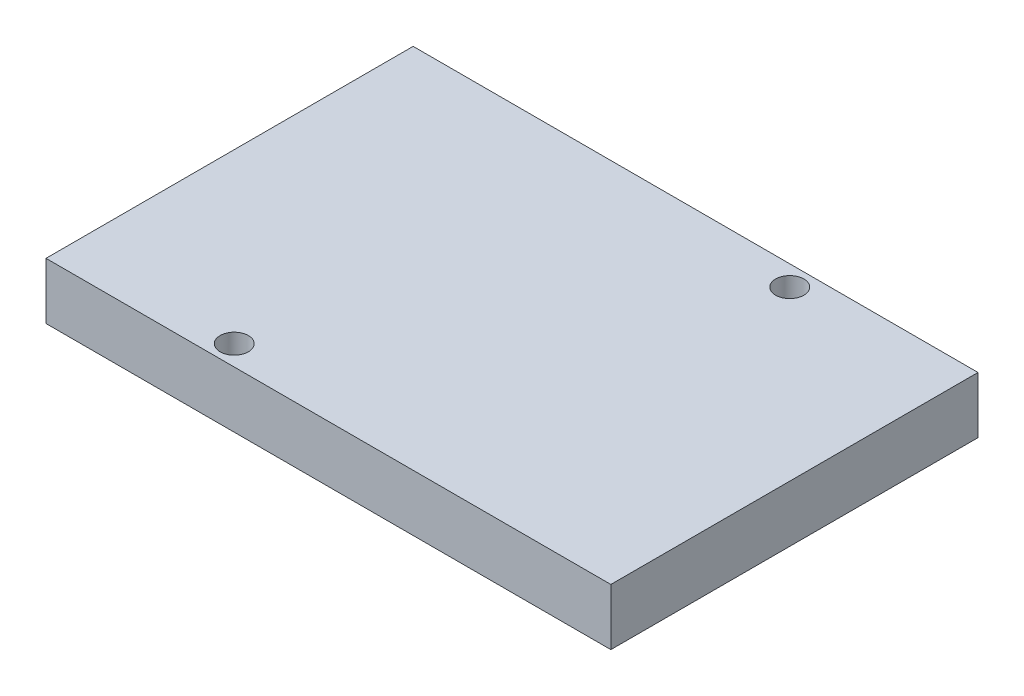
ISO-10303-21;
HEADER;
FILE_DESCRIPTION(('STEP AP214'),'2;1');
FILE_NAME('part.step','',(''),(''),'','','');
FILE_SCHEMA(('AUTOMOTIVE_DESIGN { 1 0 10303 214 1 1 1 1 }'));
ENDSEC;
DATA;
#1=APPLICATION_CONTEXT('core data for automotive mechanical design processes');
#2=APPLICATION_PROTOCOL_DEFINITION('international standard','automotive_design',2000,#1);
#3=PRODUCT_CONTEXT('',#1,'mechanical');
#4=PRODUCT('Part','Part','',(#3));
#5=PRODUCT_RELATED_PRODUCT_CATEGORY('part','',(#4));
#6=PRODUCT_DEFINITION_FORMATION('','',#4);
#7=PRODUCT_DEFINITION_CONTEXT('part definition',#1,'design');
#8=PRODUCT_DEFINITION('design','',#6,#7);
#9=PRODUCT_DEFINITION_SHAPE('','',#8);
#10=(LENGTH_UNIT() NAMED_UNIT(*) SI_UNIT(.MILLI.,.METRE.));
#11=(NAMED_UNIT(*) PLANE_ANGLE_UNIT() SI_UNIT($,.RADIAN.));
#12=(NAMED_UNIT(*) SI_UNIT($,.STERADIAN.) SOLID_ANGLE_UNIT());
#13=UNCERTAINTY_MEASURE_WITH_UNIT(LENGTH_MEASURE(1.E-05),#10,'distance_accuracy_value','');
#14=(GEOMETRIC_REPRESENTATION_CONTEXT(3) GLOBAL_UNCERTAINTY_ASSIGNED_CONTEXT((#13)) GLOBAL_UNIT_ASSIGNED_CONTEXT((#10,
#11,#12)) REPRESENTATION_CONTEXT('',''));
#15=CARTESIAN_POINT('',(0.,0.,0.));
#16=DIRECTION('',(0.,0.,1.));
#17=DIRECTION('',(1.,0.,0.));
#18=AXIS2_PLACEMENT_3D('',#15,#16,#17);
#19=CARTESIAN_POINT('',(0.,10.,0.));
#20=DIRECTION('',(1.,0.,0.));
#21=DIRECTION('',(0.,0.,-1.));
#22=AXIS2_PLACEMENT_3D('',#19,#20,#21);
#23=PLANE('',#22);
#24=DIRECTION('',(0.,0.,1.));
#25=VECTOR('',#24,1.);
#26=CARTESIAN_POINT('',(0.,0.,0.));
#27=LINE('',#26,#25);
#28=CARTESIAN_POINT('',(0.,0.,-65.));
#29=VERTEX_POINT('',#28);
#30=CARTESIAN_POINT('',(0.,0.,0.));
#31=VERTEX_POINT('',#30);
#32=EDGE_CURVE('E102',#29,#31,#27,.T.);
#33=ORIENTED_EDGE('',*,*,#32,.T.);
#34=DIRECTION('',(0.,-1.,0.));
#35=VECTOR('',#34,1.);
#36=CARTESIAN_POINT('',(0.,10.,0.));
#37=LINE('',#36,#35);
#38=CARTESIAN_POINT('',(0.,10.,0.));
#39=VERTEX_POINT('',#38);
#40=EDGE_CURVE('E12',#39,#31,#37,.T.);
#41=ORIENTED_EDGE('',*,*,#40,.F.);
#42=DIRECTION('',(0.,0.,1.));
#43=VECTOR('',#42,1.);
#44=CARTESIAN_POINT('',(0.,10.,0.));
#45=LINE('',#44,#43);
#46=CARTESIAN_POINT('',(0.,10.,-65.));
#47=VERTEX_POINT('',#46);
#48=EDGE_CURVE('E90',#47,#39,#45,.T.);
#49=ORIENTED_EDGE('',*,*,#48,.F.);
#50=DIRECTION('',(0.,-1.,0.));
#51=VECTOR('',#50,1.);
#52=CARTESIAN_POINT('',(0.,10.,-65.));
#53=LINE('',#52,#51);
#54=EDGE_CURVE('E98',#47,#29,#53,.T.);
#55=ORIENTED_EDGE('',*,*,#54,.T.);
#56=EDGE_LOOP('',(#33,#41,#49,#55));
#57=FACE_BOUND('',#56,.T.);
#58=ADVANCED_FACE('F39',(#57),#23,.F.);
#59=CARTESIAN_POINT('',(0.,10.,0.));
#60=DIRECTION('',(0.,0.,-1.));
#61=DIRECTION('',(-1.,0.,0.));
#62=AXIS2_PLACEMENT_3D('',#59,#60,#61);
#63=PLANE('',#62);
#64=DIRECTION('',(1.,0.,0.));
#65=VECTOR('',#64,1.);
#66=CARTESIAN_POINT('',(0.,0.,0.));
#67=LINE('',#66,#65);
#68=CARTESIAN_POINT('',(100.,0.,0.));
#69=VERTEX_POINT('',#68);
#70=EDGE_CURVE('E94',#31,#69,#67,.T.);
#71=ORIENTED_EDGE('',*,*,#70,.T.);
#72=DIRECTION('',(0.,-1.,0.));
#73=VECTOR('',#72,1.);
#74=CARTESIAN_POINT('',(100.,10.,0.));
#75=LINE('',#74,#73);
#76=CARTESIAN_POINT('',(100.,10.,0.));
#77=VERTEX_POINT('',#76);
#78=EDGE_CURVE('E47',#77,#69,#75,.T.);
#79=ORIENTED_EDGE('',*,*,#78,.F.);
#80=DIRECTION('',(1.,0.,0.));
#81=VECTOR('',#80,1.);
#82=CARTESIAN_POINT('',(0.,10.,0.));
#83=LINE('',#82,#81);
#84=EDGE_CURVE('E85',#39,#77,#83,.T.);
#85=ORIENTED_EDGE('',*,*,#84,.F.);
#86=ORIENTED_EDGE('',*,*,#40,.T.);
#87=EDGE_LOOP('',(#71,#79,#85,#86));
#88=FACE_BOUND('',#87,.T.);
#89=ADVANCED_FACE('F93',(#88),#63,.F.);
#90=CARTESIAN_POINT('',(100.,10.,0.));
#91=DIRECTION('',(-1.,0.,0.));
#92=DIRECTION('',(0.,0.,1.));
#93=AXIS2_PLACEMENT_3D('',#90,#91,#92);
#94=PLANE('',#93);
#95=DIRECTION('',(0.,0.,-1.));
#96=VECTOR('',#95,1.);
#97=CARTESIAN_POINT('',(100.,0.,0.));
#98=LINE('',#97,#96);
#99=CARTESIAN_POINT('',(100.,0.,-65.));
#100=VERTEX_POINT('',#99);
#101=EDGE_CURVE('E72',#69,#100,#98,.T.);
#102=ORIENTED_EDGE('',*,*,#101,.T.);
#103=DIRECTION('',(0.,-1.,0.));
#104=VECTOR('',#103,1.);
#105=CARTESIAN_POINT('',(100.,10.,-65.));
#106=LINE('',#105,#104);
#107=CARTESIAN_POINT('',(100.,10.,-65.));
#108=VERTEX_POINT('',#107);
#109=EDGE_CURVE('E95',#108,#100,#106,.T.);
#110=ORIENTED_EDGE('',*,*,#109,.F.);
#111=DIRECTION('',(0.,0.,-1.));
#112=VECTOR('',#111,1.);
#113=CARTESIAN_POINT('',(100.,10.,0.));
#114=LINE('',#113,#112);
#115=EDGE_CURVE('E88',#77,#108,#114,.T.);
#116=ORIENTED_EDGE('',*,*,#115,.F.);
#117=ORIENTED_EDGE('',*,*,#78,.T.);
#118=EDGE_LOOP('',(#102,#110,#116,#117));
#119=FACE_BOUND('',#118,.T.);
#120=ADVANCED_FACE('F96',(#119),#94,.F.);
#121=CARTESIAN_POINT('',(0.,10.,-65.));
#122=DIRECTION('',(0.,0.,1.));
#123=DIRECTION('',(1.,0.,0.));
#124=AXIS2_PLACEMENT_3D('',#121,#122,#123);
#125=PLANE('',#124);
#126=CARTESIAN_POINT('',(59.,5.,-65.));
#127=DIRECTION('',(0.,0.,-1.));
#128=DIRECTION('',(-1.,0.,0.));
#129=AXIS2_PLACEMENT_3D('',#126,#127,#128);
#130=CIRCLE('',#129,2.49999999999999);
#131=CARTESIAN_POINT('',(56.5,5.,-65.));
#132=VERTEX_POINT('',#131);
#133=EDGE_CURVE('E123',#132,#132,#130,.T.);
#134=ORIENTED_EDGE('',*,*,#133,.F.);
#135=EDGE_LOOP('',(#134));
#136=FACE_BOUND('',#135,.T.);
#137=CARTESIAN_POINT('',(41.,5.,-65.));
#138=DIRECTION('',(0.,0.,-1.));
#139=DIRECTION('',(-1.,0.,0.));
#140=AXIS2_PLACEMENT_3D('',#137,#138,#139);
#141=CIRCLE('',#140,2.49999999999999);
#142=CARTESIAN_POINT('',(38.5,5.,-65.));
#143=VERTEX_POINT('',#142);
#144=EDGE_CURVE('E119',#143,#143,#141,.T.);
#145=ORIENTED_EDGE('',*,*,#144,.F.);
#146=EDGE_LOOP('',(#145));
#147=FACE_BOUND('',#146,.T.);
#148=DIRECTION('',(-1.,0.,0.));
#149=VECTOR('',#148,1.);
#150=CARTESIAN_POINT('',(0.,0.,-65.));
#151=LINE('',#150,#149);
#152=EDGE_CURVE('E78',#100,#29,#151,.T.);
#153=ORIENTED_EDGE('',*,*,#152,.T.);
#154=ORIENTED_EDGE('',*,*,#54,.F.);
#155=DIRECTION('',(-1.,0.,0.));
#156=VECTOR('',#155,1.);
#157=CARTESIAN_POINT('',(0.,10.,-65.));
#158=LINE('',#157,#156);
#159=EDGE_CURVE('E55',#108,#47,#158,.T.);
#160=ORIENTED_EDGE('',*,*,#159,.F.);
#161=ORIENTED_EDGE('',*,*,#109,.T.);
#162=EDGE_LOOP('',(#153,#154,#160,#161));
#163=FACE_BOUND('',#162,.T.);
#164=ADVANCED_FACE('F110',(#136,#147,#163),#125,.F.);
#165=CARTESIAN_POINT('',(0.,10.,0.));
#166=DIRECTION('',(0.,-1.,0.));
#167=DIRECTION('',(0.,0.,-1.));
#168=AXIS2_PLACEMENT_3D('',#165,#166,#167);
#169=PLANE('',#168);
#170=CARTESIAN_POINT('',(70.25,10.,-61.425));
#171=DIRECTION('',(0.,1.,0.));
#172=DIRECTION('',(0.,0.,1.));
#173=AXIS2_PLACEMENT_3D('',#170,#171,#172);
#174=CIRCLE('',#173,2.50000000000001);
#175=CARTESIAN_POINT('',(70.25,10.,-58.925));
#176=VERTEX_POINT('',#175);
#177=EDGE_CURVE('E131',#176,#176,#174,.T.);
#178=ORIENTED_EDGE('',*,*,#177,.F.);
#179=EDGE_LOOP('',(#178));
#180=FACE_BOUND('',#179,.T.);
#181=CARTESIAN_POINT('',(29.75,10.,-3.575));
#182=DIRECTION('',(0.,1.,0.));
#183=DIRECTION('',(0.,0.,1.));
#184=AXIS2_PLACEMENT_3D('',#181,#182,#183);
#185=CIRCLE('',#184,2.49999999999999);
#186=CARTESIAN_POINT('',(29.75,10.,-1.07500000000001));
#187=VERTEX_POINT('',#186);
#188=EDGE_CURVE('E128',#187,#187,#185,.T.);
#189=ORIENTED_EDGE('',*,*,#188,.F.);
#190=EDGE_LOOP('',(#189));
#191=FACE_BOUND('',#190,.T.);
#192=ORIENTED_EDGE('',*,*,#48,.T.);
#193=ORIENTED_EDGE('',*,*,#84,.T.);
#194=ORIENTED_EDGE('',*,*,#115,.T.);
#195=ORIENTED_EDGE('',*,*,#159,.T.);
#196=EDGE_LOOP('',(#192,#193,#194,#195));
#197=FACE_BOUND('',#196,.T.);
#198=ADVANCED_FACE('F86',(#180,#191,#197),#169,.F.);
#199=CARTESIAN_POINT('',(0.,0.,0.));
#200=DIRECTION('',(0.,-1.,0.));
#201=DIRECTION('',(0.,0.,-1.));
#202=AXIS2_PLACEMENT_3D('',#199,#200,#201);
#203=PLANE('',#202);
#204=ORIENTED_EDGE('',*,*,#32,.F.);
#205=ORIENTED_EDGE('',*,*,#152,.F.);
#206=ORIENTED_EDGE('',*,*,#101,.F.);
#207=ORIENTED_EDGE('',*,*,#70,.F.);
#208=EDGE_LOOP('',(#204,#205,#206,#207));
#209=FACE_BOUND('',#208,.T.);
#210=ADVANCED_FACE('F113',(#209),#203,.T.);
#211=CARTESIAN_POINT('',(41.,5.,-55.));
#212=DIRECTION('',(0.,0.,-1.));
#213=DIRECTION('',(-1.,0.,0.));
#214=AXIS2_PLACEMENT_3D('',#211,#212,#213);
#215=CYLINDRICAL_SURFACE('',#214,2.49999999999999);
#216=CARTESIAN_POINT('',(41.,5.,-55.));
#217=DIRECTION('',(0.,0.,-1.));
#218=DIRECTION('',(-1.,0.,0.));
#219=AXIS2_PLACEMENT_3D('',#216,#217,#218);
#220=CIRCLE('',#219,2.49999999999999);
#221=CARTESIAN_POINT('',(38.5,5.,-55.));
#222=VERTEX_POINT('',#221);
#223=EDGE_CURVE('E116',#222,#222,#220,.T.);
#224=ORIENTED_EDGE('',*,*,#223,.F.);
#225=EDGE_LOOP('',(#224));
#226=FACE_BOUND('',#225,.T.);
#227=ORIENTED_EDGE('',*,*,#144,.T.);
#228=EDGE_LOOP('',(#227));
#229=FACE_BOUND('',#228,.T.);
#230=ADVANCED_FACE('F179',(#226,#229),#215,.F.);
#231=CARTESIAN_POINT('',(41.,5.,-55.));
#232=DIRECTION('',(0.,0.,-1.));
#233=DIRECTION('',(-1.,0.,0.));
#234=AXIS2_PLACEMENT_3D('',#231,#232,#233);
#235=PLANE('',#234);
#236=ORIENTED_EDGE('',*,*,#223,.T.);
#237=EDGE_LOOP('',(#236));
#238=FACE_BOUND('',#237,.T.);
#239=ADVANCED_FACE('F181',(#238),#235,.T.);
#240=CARTESIAN_POINT('',(59.,5.,-55.));
#241=DIRECTION('',(0.,0.,-1.));
#242=DIRECTION('',(-1.,0.,0.));
#243=AXIS2_PLACEMENT_3D('',#240,#241,#242);
#244=CYLINDRICAL_SURFACE('',#243,2.49999999999999);
#245=CARTESIAN_POINT('',(59.,5.,-55.));
#246=DIRECTION('',(0.,0.,-1.));
#247=DIRECTION('',(-1.,0.,0.));
#248=AXIS2_PLACEMENT_3D('',#245,#246,#247);
#249=CIRCLE('',#248,2.49999999999999);
#250=CARTESIAN_POINT('',(56.5,5.,-55.));
#251=VERTEX_POINT('',#250);
#252=EDGE_CURVE('E105',#251,#251,#249,.T.);
#253=ORIENTED_EDGE('',*,*,#252,.F.);
#254=EDGE_LOOP('',(#253));
#255=FACE_BOUND('',#254,.T.);
#256=ORIENTED_EDGE('',*,*,#133,.T.);
#257=EDGE_LOOP('',(#256));
#258=FACE_BOUND('',#257,.T.);
#259=ADVANCED_FACE('F162',(#255,#258),#244,.F.);
#260=CARTESIAN_POINT('',(59.,5.,-55.));
#261=DIRECTION('',(0.,0.,-1.));
#262=DIRECTION('',(-1.,0.,0.));
#263=AXIS2_PLACEMENT_3D('',#260,#261,#262);
#264=PLANE('',#263);
#265=ORIENTED_EDGE('',*,*,#252,.T.);
#266=EDGE_LOOP('',(#265));
#267=FACE_BOUND('',#266,.T.);
#268=ADVANCED_FACE('F157',(#267),#264,.T.);
#269=CARTESIAN_POINT('',(0.,6.,0.));
#270=DIRECTION('',(0.,-1.,0.));
#271=DIRECTION('',(0.,0.,-1.));
#272=AXIS2_PLACEMENT_3D('',#269,#270,#271);
#273=PLANE('',#272);
#274=CARTESIAN_POINT('',(29.75,6.,-3.575));
#275=DIRECTION('',(0.,-1.,0.));
#276=DIRECTION('',(0.,0.,-1.));
#277=AXIS2_PLACEMENT_3D('',#274,#275,#276);
#278=CIRCLE('',#277,2.49999999999999);
#279=CARTESIAN_POINT('',(29.75,6.,-6.07499999999999));
#280=VERTEX_POINT('',#279);
#281=EDGE_CURVE('E132',#280,#280,#278,.F.);
#282=ORIENTED_EDGE('',*,*,#281,.T.);
#283=EDGE_LOOP('',(#282));
#284=FACE_BOUND('',#283,.T.);
#285=ADVANCED_FACE('F152',(#284),#273,.F.);
#286=CARTESIAN_POINT('',(29.75,-5.07106781186551,-3.575));
#287=DIRECTION('',(0.,1.,0.));
#288=DIRECTION('',(0.,0.,1.));
#289=AXIS2_PLACEMENT_3D('',#286,#287,#288);
#290=CYLINDRICAL_SURFACE('',#289,2.49999999999999);
#291=ORIENTED_EDGE('',*,*,#188,.T.);
#292=EDGE_LOOP('',(#291));
#293=FACE_BOUND('',#292,.T.);
#294=ORIENTED_EDGE('',*,*,#281,.F.);
#295=EDGE_LOOP('',(#294));
#296=FACE_BOUND('',#295,.T.);
#297=ADVANCED_FACE('F148',(#293,#296),#290,.F.);
#298=CARTESIAN_POINT('',(0.,6.,0.));
#299=DIRECTION('',(0.,-1.,0.));
#300=DIRECTION('',(0.,0.,-1.));
#301=AXIS2_PLACEMENT_3D('',#298,#299,#300);
#302=PLANE('',#301);
#303=CARTESIAN_POINT('',(70.25,6.,-61.425));
#304=DIRECTION('',(0.,-1.,0.));
#305=DIRECTION('',(0.,0.,-1.));
#306=AXIS2_PLACEMENT_3D('',#303,#304,#305);
#307=CIRCLE('',#306,2.50000000000001);
#308=CARTESIAN_POINT('',(70.25,6.,-63.925));
#309=VERTEX_POINT('',#308);
#310=EDGE_CURVE('E120',#309,#309,#307,.F.);
#311=ORIENTED_EDGE('',*,*,#310,.T.);
#312=EDGE_LOOP('',(#311));
#313=FACE_BOUND('',#312,.T.);
#314=ADVANCED_FACE('F151',(#313),#302,.F.);
#315=CARTESIAN_POINT('',(70.25,-5.07106781186551,-61.425));
#316=DIRECTION('',(0.,1.,0.));
#317=DIRECTION('',(0.,0.,1.));
#318=AXIS2_PLACEMENT_3D('',#315,#316,#317);
#319=CYLINDRICAL_SURFACE('',#318,2.50000000000001);
#320=ORIENTED_EDGE('',*,*,#177,.T.);
#321=EDGE_LOOP('',(#320));
#322=FACE_BOUND('',#321,.T.);
#323=ORIENTED_EDGE('',*,*,#310,.F.);
#324=EDGE_LOOP('',(#323));
#325=FACE_BOUND('',#324,.T.);
#326=ADVANCED_FACE('F140',(#322,#325),#319,.F.);
#327=CLOSED_SHELL('',(#58,#89,#120,#164,#198,#210,#230,#239,#259,#268,#285,#297,#314,#326));
#328=MANIFOLD_SOLID_BREP('B2',#327);
#329=ADVANCED_BREP_SHAPE_REPRESENTATION('',(#18,#328),#14);
#330=SHAPE_DEFINITION_REPRESENTATION(#9,#329);
ENDSEC;
END-ISO-10303-21;
